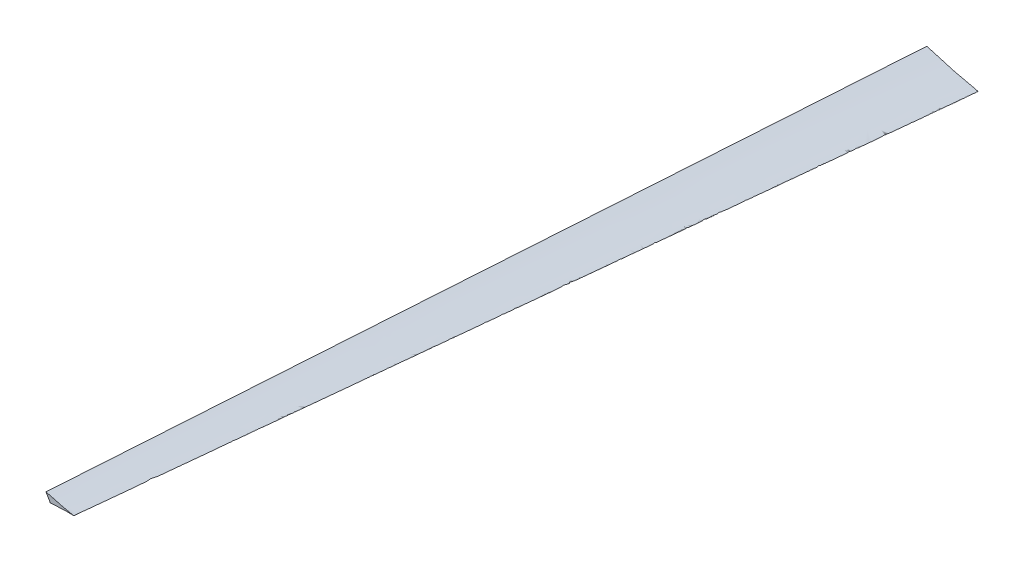
ISO-10303-21;
HEADER;
FILE_DESCRIPTION(('STEP AP214'),'2;1');
FILE_NAME('part.step','',(''),(''),'','','');
FILE_SCHEMA(('AUTOMOTIVE_DESIGN { 1 0 10303 214 1 1 1 1 }'));
ENDSEC;
DATA;
#1=APPLICATION_CONTEXT('core data for automotive mechanical design processes');
#2=APPLICATION_PROTOCOL_DEFINITION('international standard','automotive_design',2000,#1);
#3=PRODUCT_CONTEXT('',#1,'mechanical');
#4=PRODUCT('Part','Part','',(#3));
#5=PRODUCT_RELATED_PRODUCT_CATEGORY('part','',(#4));
#6=PRODUCT_DEFINITION_FORMATION('','',#4);
#7=PRODUCT_DEFINITION_CONTEXT('part definition',#1,'design');
#8=PRODUCT_DEFINITION('design','',#6,#7);
#9=PRODUCT_DEFINITION_SHAPE('','',#8);
#10=(LENGTH_UNIT() NAMED_UNIT(*) SI_UNIT(.MILLI.,.METRE.));
#11=(NAMED_UNIT(*) PLANE_ANGLE_UNIT() SI_UNIT($,.RADIAN.));
#12=(NAMED_UNIT(*) SI_UNIT($,.STERADIAN.) SOLID_ANGLE_UNIT());
#13=UNCERTAINTY_MEASURE_WITH_UNIT(LENGTH_MEASURE(1.E-05),#10,'distance_accuracy_value','');
#14=(GEOMETRIC_REPRESENTATION_CONTEXT(3) GLOBAL_UNCERTAINTY_ASSIGNED_CONTEXT((#13)) GLOBAL_UNIT_ASSIGNED_CONTEXT((#10,
#11,#12)) REPRESENTATION_CONTEXT('',''));
#15=CARTESIAN_POINT('',(0.,0.,0.));
#16=DIRECTION('',(0.,0.,1.));
#17=DIRECTION('',(1.,0.,0.));
#18=AXIS2_PLACEMENT_3D('',#15,#16,#17);
#19=CARTESIAN_POINT('',(-17.154805273375,-0.0944313994261866,225.));
#20=DIRECTION('',(0.,0.,1.));
#21=DIRECTION('',(1.,0.,0.));
#22=AXIS2_PLACEMENT_3D('',#19,#20,#21);
#23=PLANE('',#22);
#24=CARTESIAN_POINT('',(-17.154805273375,4.28745633119217,225.));
#25=CARTESIAN_POINT('',(-16.8274548071553,4.1785414780869,225.));
#26=CARTESIAN_POINT('',(-16.4997626321677,4.07062789318902,225.));
#27=CARTESIAN_POINT('',(-15.8434358874469,3.85764369440727,225.));
#28=CARTESIAN_POINT('',(-15.5148012638477,3.75257324675611,225.));
#29=CARTESIAN_POINT('',(-14.8564420552127,3.54615163630799,225.));
#30=CARTESIAN_POINT('',(-14.5267177290347,3.44479965095829,225.));
#31=CARTESIAN_POINT('',(-13.8659769446236,3.24642624477634,225.));
#32=CARTESIAN_POINT('',(-13.5349605213973,3.14940470749253,225.));
#33=CARTESIAN_POINT('',(-12.8716483663999,2.95979194422028,225.));
#34=CARTESIAN_POINT('',(-12.5393525844816,2.86720089384415,225.));
#35=CARTESIAN_POINT('',(-11.8737026407707,2.68589221610166,225.));
#36=CARTESIAN_POINT('',(-11.5403484606969,2.59717465603556,225.));
#37=CARTESIAN_POINT('',(-10.8733992873959,2.42315086030483,225.));
#38=CARTESIAN_POINT('',(-10.5398058295831,2.3378387249274,225.));
#39=CARTESIAN_POINT('',(-9.87195586824423,2.16984964748878,225.));
#40=CARTESIAN_POINT('',(-9.53769936173265,2.08717271732175,225.));
#41=CARTESIAN_POINT('',(-8.86860293943237,1.92411829040412,225.));
#42=CARTESIAN_POINT('',(-8.5337629863441,1.84374094685014,225.));
#43=CARTESIAN_POINT('',(-8.03115106262943,1.72466007935411,225.));
#44=CARTESIAN_POINT('',(-7.86355452081473,1.68521385040906,225.));
#45=CARTESIAN_POINT('',(-7.52825652693458,1.60676901085397,225.));
#46=CARTESIAN_POINT('',(-7.36055507475669,1.5677704007245,225.));
#47=CARTESIAN_POINT('',(-6.85730799932812,1.45156090581878,225.));
#48=CARTESIAN_POINT('',(-6.52158219389296,1.37512746124543,225.));
#49=CARTESIAN_POINT('',(-5.84951843928526,1.22501059156834,225.));
#50=CARTESIAN_POINT('',(-5.51318049849608,1.15132712909572,225.));
#51=CARTESIAN_POINT('',(-5.09242218145986,1.06133418195883,225.));
#52=CARTESIAN_POINT('',(-5.00833595324813,1.04345846511535,225.));
#53=CARTESIAN_POINT('',(-4.84011044559487,1.00795412760479,225.));
#54=CARTESIAN_POINT('',(-4.75597116558311,0.990325509642685,225.));
#55=CARTESIAN_POINT('',(-4.58772223709505,0.954907069724684,225.));
#56=CARTESIAN_POINT('',(-4.50361259024164,0.937117240043234,225.));
#57=CARTESIAN_POINT('',(-4.33550758699842,0.900956519205938,225.));
#58=CARTESIAN_POINT('',(-4.25151224353212,0.882585567253631,225.));
#59=CARTESIAN_POINT('',(-4.12569105641751,0.854266008962863,225.));
#60=CARTESIAN_POINT('',(-4.08377945012938,0.844699003817836,225.));
#61=CARTESIAN_POINT('',(-4.00002919467849,0.825257465364728,225.));
#62=CARTESIAN_POINT('',(-3.95819054264279,0.815382944469214,225.));
#63=CARTESIAN_POINT('',(-3.89549767905875,0.800299184135946,225.));
#64=CARTESIAN_POINT('',(-3.87461072982699,0.795225889118305,225.));
#65=CARTESIAN_POINT('',(-3.83286163533248,0.784983248998435,225.));
#66=CARTESIAN_POINT('',(-3.81199948878042,0.779813909144001,225.));
#67=CARTESIAN_POINT('',(-3.77029924049977,0.769367507842391,225.));
#68=CARTESIAN_POINT('',(-3.74946114201541,0.764090433329219,225.));
#69=CARTESIAN_POINT('',(-3.71822232217621,0.756100728274336,225.));
#70=CARTESIAN_POINT('',(-3.70781182720182,0.753424985364002,225.));
#71=CARTESIAN_POINT('',(-3.69220326178913,0.749377434636501,225.));
#72=CARTESIAN_POINT('',(-3.68700127796039,0.748022509265604,225.));
#73=CARTESIAN_POINT('',(-3.67659361044561,0.745328448450249,225.));
#74=CARTESIAN_POINT('',(-3.67138792616977,0.743989316893821,225.));
#75=CARTESIAN_POINT('',(-3.66521703496061,0.742341741978213,225.));
#76=CARTESIAN_POINT('',(-3.66424292685249,0.742079879254696,225.));
#77=CARTESIAN_POINT('',(-3.66227502606838,0.741642940281884,225.));
#78=CARTESIAN_POINT('',(-3.66128123515484,0.741467856298407,225.));
#79=CARTESIAN_POINT('',(-3.65832373585265,0.740837406072157,225.));
#80=CARTESIAN_POINT('',(-3.6563841408231,0.74027685803549,225.));
#81=CARTESIAN_POINT('',(-3.65249412694959,0.739198343487737,225.));
#82=CARTESIAN_POINT('',(-3.65054369877125,0.738680423007299,225.));
#83=CARTESIAN_POINT('',(-3.64664508413204,0.737634000052776,225.));
#84=CARTESIAN_POINT('',(-3.6446968975096,0.737105498399429,225.));
#85=CARTESIAN_POINT('',(-3.64080046512747,0.736052349809715,225.));
#86=CARTESIAN_POINT('',(-3.63885221966218,0.735527701506108,225.));
#87=CARTESIAN_POINT('',(-3.62912577391706,0.732909551205257,225.));
#88=CARTESIAN_POINT('',(-3.62134658390424,0.73081910600019,225.));
#89=CARTESIAN_POINT('',(-3.60578374931739,0.726651030484382,225.));
#90=CARTESIAN_POINT('',(-3.59800010428712,0.724573401922848,225.));
#91=CARTESIAN_POINT('',(-3.5746326556693,0.718354596854568,225.));
#92=CARTESIAN_POINT('',(-3.55904422767682,0.714230702693071,225.));
#93=CARTESIAN_POINT('',(-3.51212162435943,0.701893434567751,225.));
#94=CARTESIAN_POINT('',(-3.48076857928444,0.69375177768733,225.));
#95=CARTESIAN_POINT('',(-3.41801270675731,0.677658599796939,225.));
#96=CARTESIAN_POINT('',(-3.38660987780582,0.669707084634112,225.));
#97=CARTESIAN_POINT('',(-3.32405533048183,0.654070246776757,225.));
#98=CARTESIAN_POINT('',(-3.29290406502051,0.646383111429674,225.));
#99=CARTESIAN_POINT('',(-3.23055752445818,0.631198114504695,225.));
#100=CARTESIAN_POINT('',(-3.19936225239717,0.623700240469484,225.));
#101=CARTESIAN_POINT('',(-3.16042484995846,0.614466820167934,225.));
#102=CARTESIAN_POINT('',(-3.15270373313613,0.612642011848339,225.));
#103=CARTESIAN_POINT('',(-3.13725750879792,0.609003735334887,225.));
#104=CARTESIAN_POINT('',(-3.12953240085992,0.607190268863578,225.));
#105=CARTESIAN_POINT('',(-3.11383593754043,0.603518076207636,225.));
#106=CARTESIAN_POINT('',(-3.10586450712097,0.601659728491853,225.));
#107=CARTESIAN_POINT('',(-3.0899206522803,0.597955753518307,225.));
#108=CARTESIAN_POINT('',(-3.0819482297589,0.596110121136527,225.));
#109=CARTESIAN_POINT('',(-3.06571389109494,0.592690870335003,225.));
#110=CARTESIAN_POINT('',(-3.05745009387546,0.591126253510152,225.));
#111=CARTESIAN_POINT('',(-3.04162116039135,0.588077777033081,225.));
#112=CARTESIAN_POINT('',(-3.03405521991084,0.586598060980688,225.));
#113=CARTESIAN_POINT('',(-3.02303042831966,0.584184046578137,225.));
#114=CARTESIAN_POINT('',(-3.01954353537087,0.583382441190433,225.));
#115=CARTESIAN_POINT('',(-3.01387282301738,0.581906147209993,225.));
#116=CARTESIAN_POINT('',(-3.01167476480427,0.581290759728336,225.));
#117=CARTESIAN_POINT('',(-3.00739326457138,0.579891400688233,225.));
#118=CARTESIAN_POINT('',(-3.00530833122601,0.579112016304118,225.));
#119=CARTESIAN_POINT('',(-3.00264169503904,0.578135834360096,225.));
#120=CARTESIAN_POINT('',(-3.00206258646044,0.577925080208735,225.));
#121=CARTESIAN_POINT('',(-3.00085965518218,0.577495254586606,225.));
#122=CARTESIAN_POINT('',(-3.00023552631687,0.57727662553344,225.));
#123=CARTESIAN_POINT('',(-2.99924573830725,0.576903545803914,225.));
#124=CARTESIAN_POINT('',(-2.99887438763264,0.576757403600882,225.));
#125=CARTESIAN_POINT('',(-2.99815948532871,0.576535510814437,225.));
#126=CARTESIAN_POINT('',(-2.99782088588455,0.576452266799612,225.));
#127=CARTESIAN_POINT('',(-2.99743622946987,0.576084050380615,225.));
#128=CARTESIAN_POINT('',(-2.99732797917685,0.575916829913171,225.));
#129=CARTESIAN_POINT('',(-2.99731846443562,0.575582325756103,225.));
#130=CARTESIAN_POINT('',(-2.99741449170376,0.575415071926438,225.));
#131=CARTESIAN_POINT('',(-2.99763058990211,0.57514390033606,225.));
#132=CARTESIAN_POINT('',(-2.9977491129938,0.575037090540749,225.));
#133=CARTESIAN_POINT('',(-2.99801249519448,0.574830932659052,225.));
#134=CARTESIAN_POINT('',(-2.99815867932423,0.574732792017633,225.));
#135=CARTESIAN_POINT('',(-2.99875677864825,0.574368407379817,225.));
#136=CARTESIAN_POINT('',(-2.99923755098296,0.574156803282837,225.));
#137=CARTESIAN_POINT('',(-3.00023699953781,0.573780242324813,225.));
#138=CARTESIAN_POINT('',(-3.00075642274887,0.573617480638455,225.));
#139=CARTESIAN_POINT('',(-3.00232321202461,0.573196546046507,225.));
#140=CARTESIAN_POINT('',(-3.00338804266163,0.573001672156346,225.));
#141=CARTESIAN_POINT('',(-3.00550123673462,0.572762959594685,225.));
#142=CARTESIAN_POINT('',(-3.00654917082746,0.572714869932024,225.));
#143=CARTESIAN_POINT('',(-3.00885539206171,0.572731437702185,225.));
#144=CARTESIAN_POINT('',(-3.0101130094573,0.572821079123196,225.));
#145=CARTESIAN_POINT('',(-3.01262981569765,0.572965280922988,225.));
#146=CARTESIAN_POINT('',(-3.01388900503319,0.573019819708073,225.));
#147=CARTESIAN_POINT('',(-3.01766602889692,0.573194045402037,225.));
#148=CARTESIAN_POINT('',(-3.0201835963714,0.573324351311769,225.));
#149=CARTESIAN_POINT('',(-3.02526701691628,0.573582594674771,225.));
#150=CARTESIAN_POINT('',(-3.02783287105203,0.573710438931706,225.));
#151=CARTESIAN_POINT('',(-3.03296420056645,0.573970041567609,225.));
#152=CARTESIAN_POINT('',(-3.03552967595844,0.574101799594211,225.));
#153=CARTESIAN_POINT('',(-3.04829608693929,0.57476186140483,225.));
#154=CARTESIAN_POINT('',(-3.05849630676072,0.575303232542896,225.));
#155=CARTESIAN_POINT('',(-3.07889586309809,0.576411651998802,225.));
#156=CARTESIAN_POINT('',(-3.08909519954762,0.57697870155472,225.));
#157=CARTESIAN_POINT('',(-3.10940965602912,0.578126025189434,225.));
#158=CARTESIAN_POINT('',(-3.11952478436374,0.578706153660477,225.));
#159=CARTESIAN_POINT('',(-3.13975414039082,0.57987867864631,225.));
#160=CARTESIAN_POINT('',(-3.14986836809638,0.580471074936353,225.));
#161=CARTESIAN_POINT('',(-3.20053747623567,0.583447979451554,225.));
#162=CARTESIAN_POINT('',(-3.24109081066037,0.585860041341564,225.));
#163=CARTESIAN_POINT('',(-3.32221098128255,0.59044817108018,225.));
#164=CARTESIAN_POINT('',(-3.36277781750137,0.592624238554107,225.));
#165=CARTESIAN_POINT('',(-3.4440554688945,0.596843599158316,225.));
#166=CARTESIAN_POINT('',(-3.48476630808849,0.598886419584199,225.));
#167=CARTESIAN_POINT('',(-3.56619317899834,0.602871699749472,225.));
#168=CARTESIAN_POINT('',(-3.6069092107506,0.604814158741499,225.));
#169=CARTESIAN_POINT('',(-3.81033979871796,0.614457325326993,225.));
#170=CARTESIAN_POINT('',(-3.9730631624705,0.621972707122369,225.));
#171=CARTESIAN_POINT('',(-4.29854396124656,0.636203601520358,225.));
#172=CARTESIAN_POINT('',(-4.46130139580784,0.642919124348926,225.));
#173=CARTESIAN_POINT('',(-4.7053692792409,0.651974525275915,225.));
#174=CARTESIAN_POINT('',(-4.78666079443199,0.654821817029735,225.));
#175=CARTESIAN_POINT('',(-4.94925645873141,0.660108593381518,225.));
#176=CARTESIAN_POINT('',(-5.03056060771242,0.662548081852617,225.));
#177=CARTESIAN_POINT('',(-5.19318262289072,0.666952368291811,225.));
#178=CARTESIAN_POINT('',(-5.27450048922,0.668917161397424,225.));
#179=CARTESIAN_POINT('',(-5.43714754430569,0.672404521754121,225.));
#180=CARTESIAN_POINT('',(-5.51847673328358,0.673927078593644,225.));
#181=CARTESIAN_POINT('',(-5.68130552534967,0.676557400618646,225.));
#182=CARTESIAN_POINT('',(-5.76280514193776,0.677664324701541,225.));
#183=CARTESIAN_POINT('',(-5.92581166102893,0.679486135845279,225.));
#184=CARTESIAN_POINT('',(-6.00731856368842,0.680201008858527,225.));
#185=CARTESIAN_POINT('',(-6.12957934694492,0.68099907207233,225.));
#186=CARTESIAN_POINT('',(-6.17033238870746,0.681219384151621,225.));
#187=CARTESIAN_POINT('',(-6.25183931478383,0.681571957808514,225.));
#188=CARTESIAN_POINT('',(-6.29259319910199,0.681704218411579,225.));
#189=CARTESIAN_POINT('',(-6.35372274968645,0.681838983342992,225.));
#190=CARTESIAN_POINT('',(-6.37409835302857,0.681873300571639,225.));
#191=CARTESIAN_POINT('',(-6.4148493796591,0.68192126415413,225.));
#192=CARTESIAN_POINT('',(-6.43522480294723,0.681934910718371,225.));
#193=CARTESIAN_POINT('',(-6.47597489876445,0.681941462865774,225.));
#194=CARTESIAN_POINT('',(-6.49634957129372,0.681934369208683,225.));
#195=CARTESIAN_POINT('',(-6.53709959862784,0.681901678035809,225.));
#196=CARTESIAN_POINT('',(-6.55747495343306,0.68187607991032,225.));
#197=CARTESIAN_POINT('',(-6.58803995743583,0.681819010126741,225.));
#198=CARTESIAN_POINT('',(-6.59822965811541,0.681796871561895,225.));
#199=CARTESIAN_POINT('',(-6.61351397883151,0.681765537737341,225.));
#200=CARTESIAN_POINT('',(-6.61860855126687,0.681755405760031,225.));
#201=CARTESIAN_POINT('',(-6.62879723679257,0.68172361821442,225.));
#202=CARTESIAN_POINT('',(-6.63389134989306,0.681701963238979,225.));
#203=CARTESIAN_POINT('',(-6.64153334711404,0.681698177176817,225.));
#204=CARTESIAN_POINT('',(-6.64408095405511,0.68170169884781,225.));
#205=CARTESIAN_POINT('',(-6.64917501982737,0.681629655282381,225.));
#206=CARTESIAN_POINT('',(-6.65172147867644,0.681554091324184,225.));
#207=CARTESIAN_POINT('',(-6.65936058527897,0.68132522948828,225.));
#208=CARTESIAN_POINT('',(-6.66445289206046,0.681169763696192,225.));
#209=CARTESIAN_POINT('',(-6.67973075646229,0.680722286952276,225.));
#210=CARTESIAN_POINT('',(-6.68991706600691,0.680449203213598,225.));
#211=CARTESIAN_POINT('',(-6.72047549101707,0.679681496268192,225.));
#212=CARTESIAN_POINT('',(-6.74084875755153,0.679238364599858,225.));
#213=CARTESIAN_POINT('',(-6.78159734788117,0.678477675702374,225.));
#214=CARTESIAN_POINT('',(-6.80197267163627,0.678160116374571,225.));
#215=CARTESIAN_POINT('',(-6.86310018956626,0.677359112111544,225.));
#216=CARTESIAN_POINT('',(-6.90385429816796,0.677027332426644,225.));
#217=CARTESIAN_POINT('',(-6.98536467522526,0.676602231085802,225.));
#218=CARTESIAN_POINT('',(-7.02612094370806,0.676508917155513,225.));
#219=CARTESIAN_POINT('',(-7.10763295328583,0.676390021396336,225.));
#220=CARTESIAN_POINT('',(-7.14838869438134,0.676364438764475,225.));
#221=CARTESIAN_POINT('',(-7.22989972312666,0.67623586187134,225.));
#222=CARTESIAN_POINT('',(-7.27065501077223,0.676132868939333,225.));
#223=CARTESIAN_POINT('',(-7.39291718055841,0.675358122303915,225.));
#224=CARTESIAN_POINT('',(-7.47442070277906,0.674220603727059,225.));
#225=CARTESIAN_POINT('',(-7.6374314691538,0.671745599563877,225.));
#226=CARTESIAN_POINT('',(-7.71893871279898,0.670408092976662,225.));
#227=CARTESIAN_POINT('',(-7.88194983043221,0.667420244734924,225.));
#228=CARTESIAN_POINT('',(-7.96345370430551,0.665769896145862,225.));
#229=CARTESIAN_POINT('',(-8.12645439703051,0.662191577427787,225.));
#230=CARTESIAN_POINT('',(-8.20795121594233,0.660263609959833,225.));
#231=CARTESIAN_POINT('',(-8.37093690537427,0.656125571697904,225.));
#232=CARTESIAN_POINT('',(-8.45242577596717,0.653915503790126,225.));
#233=CARTESIAN_POINT('',(-8.61539355297758,0.649219457399596,225.));
#234=CARTESIAN_POINT('',(-8.69687245959002,0.646733485665632,225.));
#235=CARTESIAN_POINT('',(-8.85982178647566,0.641488895423208,225.));
#236=CARTESIAN_POINT('',(-8.94129220671739,0.638730275937613,225.));
#237=CARTESIAN_POINT('',(-9.18568903892092,0.630051567349473,225.));
#238=CARTESIAN_POINT('',(-9.34860115766905,0.623728624203748,225.));
#239=CARTESIAN_POINT('',(-9.83753994467401,0.603184144744041,225.));
#240=CARTESIAN_POINT('',(-10.1635022486921,0.587394746748477,225.));
#241=CARTESIAN_POINT('',(-10.6522832519098,0.560766987633619,225.));
#242=CARTESIAN_POINT('',(-10.8151842534121,0.551400385955469,225.));
#243=CARTESIAN_POINT('',(-11.1409289719396,0.531718030775066,225.));
#244=CARTESIAN_POINT('',(-11.3037726890414,0.521402278544923,225.));
#245=CARTESIAN_POINT('',(-11.6293890252272,0.499852892368571,225.));
#246=CARTESIAN_POINT('',(-11.7921616481329,0.488619316087452,225.));
#247=CARTESIAN_POINT('',(-12.0362730891069,0.471107463044834,225.));
#248=CARTESIAN_POINT('',(-12.1176357516123,0.465159923049198,225.));
#249=CARTESIAN_POINT('',(-12.2803445332283,0.453042428855844,225.));
#250=CARTESIAN_POINT('',(-12.3616906523288,0.446872474524232,225.));
#251=CARTESIAN_POINT('',(-12.6057119040873,0.428149588117254,225.));
#252=CARTESIAN_POINT('',(-12.7683707049235,0.41538357598249,225.));
#253=CARTESIAN_POINT('',(-13.0936412378088,0.389267868485991,225.));
#254=CARTESIAN_POINT('',(-13.2562529699172,0.375918173864164,225.));
#255=CARTESIAN_POINT('',(-13.5628986132119,0.350202828459392,225.));
#256=CARTESIAN_POINT('',(-13.7069376657176,0.33789842563595,225.));
#257=CARTESIAN_POINT('',(-13.9949759569606,0.312846328982323,225.));
#258=CARTESIAN_POINT('',(-14.1389751960335,0.300098639011406,225.));
#259=CARTESIAN_POINT('',(-14.4268519553408,0.27417306490237,225.));
#260=CARTESIAN_POINT('',(-14.5707294981013,0.260995430828219,225.));
#261=CARTESIAN_POINT('',(-14.8584454974939,0.234208390950708,225.));
#262=CARTESIAN_POINT('',(-15.0022839538185,0.220598981844737,225.));
#263=CARTESIAN_POINT('',(-15.1461019106277,0.206776453082405,225.));
#264=B_SPLINE_CURVE_WITH_KNOTS('',3,(#24,#25,#26,#27,#28,#29,#30,#31,#32,#33,#34,#35,#36,#37,
#38,#39,#40,#41,#42,#43,#44,#45,#46,#47,#48,#49,#50,#51,#52,#53,#54,#55,#56,#57,#58,#59,#60,#61,
#62,#63,#64,#65,#66,#67,#68,#69,#70,#71,#72,#73,#74,#75,#76,#77,#78,#79,#80,#81,#82,#83,#84,#85,
#86,#87,#88,#89,#90,#91,#92,#93,#94,#95,#96,#97,#98,#99,#100,#101,#102,#103,#104,#105,#106,#107,
#108,#109,#110,#111,#112,#113,#114,#115,#116,#117,#118,#119,#120,#121,#122,#123,#124,#125,#126,
#127,#128,#129,#130,#131,#132,#133,#134,#135,#136,#137,#138,#139,#140,#141,#142,#143,#144,#145,
#146,#147,#148,#149,#150,#151,#152,#153,#154,#155,#156,#157,#158,#159,#160,#161,#162,#163,#164,
#165,#166,#167,#168,#169,#170,#171,#172,#173,#174,#175,#176,#177,#178,#179,#180,#181,#182,#183,
#184,#185,#186,#187,#188,#189,#190,#191,#192,#193,#194,#195,#196,#197,#198,#199,#200,#201,#202,
#203,#204,#205,#206,#207,#208,#209,#210,#211,#212,#213,#214,#215,#216,#217,#218,#219,#220,#221,
#222,#223,#224,#225,#226,#227,#228,#229,#230,#231,#232,#233,#234,#235,#236,#237,#238,#239,#240,
#241,#242,#243,#244,#245,#246,#247,#248,#249,#250,#251,#252,#253,#254,#255,#256,#257,#258,#259,
#260,#261,#262,#263),.UNSPECIFIED.,.F.,.F.,(4,2,2,2,2,2,2,2,2,2,2,2,2,2,2,2,2,2,2,2,2,2,2,2,2,2,
2,2,2,2,2,2,2,2,2,2,2,2,2,2,2,2,2,2,2,2,2,2,2,2,2,2,2,2,2,2,2,2,2,2,2,2,2,2,2,2,2,2,2,2,2,2,2,2,
2,2,2,2,2,2,2,2,2,2,2,2,2,2,2,2,2,2,2,2,2,2,2,2,2,2,2,2,2,2,2,2,2,2,2,2,2,2,2,2,2,2,2,2,2,4),
(0.,1.03499246503269,2.07004531388018,3.10486780329656,4.13966244816034,5.17449807551398,
6.20935167555225,7.2423268774194,8.27530674102344,9.30835526143541,9.82488302051278,
10.3414113341068,11.3743524484741,12.4072795213254,12.665175168689,12.9230736370184,
13.1809845303664,13.4389224959325,13.5678905450298,13.6968533951898,13.7613359361873,
13.825814964224,13.8903018592491,13.9225490873381,13.9386747170035,13.9548042368302,
13.9578288213369,13.960853136228,13.9669024788473,13.9729582703092,13.9790135938529,
13.985066653582,14.0092319395123,14.0334004536065,14.0817744198835,14.1789525049277,
14.2761335745108,14.3723902001445,14.4686404734899,14.4924420012689,14.5162470601664,
14.5408036102627,14.565349605836,14.5905788466542,14.6137045342053,14.6244366231596,
14.6312789798613,14.6379506911321,14.6398006326225,14.6417793631444,14.6429848180262,
14.6439988177876,14.6445198341654,14.6450339860624,14.6455208310792,14.6460451553859,
14.6476141064384,14.6492455863727,14.6524794548056,14.6556187340272,14.6593980059667,
14.6631796005423,14.6707419577163,14.6784491898066,14.6861557300869,14.7167994753268,
14.7474446996226,14.7778399429939,14.808234630017,14.930109334319,15.0519842321137,
15.1742702958769,15.2965572701379,15.7852471160521,16.273930713544,16.5179539847954,
16.7619749382903,17.0059983912772,17.2500275888392,17.4945479924358,17.739077156878,
17.8613379939187,17.983600184098,18.0447270739717,18.1058533416596,18.1669773702234,
18.2281034128633,18.258672658521,18.2739563048467,18.2892391649021,18.2968814144136,
18.3045235404089,18.3198080055295,18.3503775125398,18.411511560203,18.4726445861077,
18.5949095343997,18.7171784436988,18.8394459034604,18.9617112637298,19.2062409846633,
19.4507964019,19.6953572406508,19.9399157353701,20.1844717281881,20.4290217403247,
20.6735726289294,21.1626740000542,22.1416774092576,22.631185583151,23.1206931009847,
23.6101698876336,23.8549088691637,24.0996479980306,24.5891239284021,25.0785992383053,
25.5122894977948,25.9459759825117,26.3794145720609,26.8128564777434),.UNSPECIFIED.);
#265=CARTESIAN_POINT('',(-17.154805273375,4.28745633119217,225.));
#266=VERTEX_POINT('',#265);
#267=CARTESIAN_POINT('',(-14.8168748482416,0.238042050299872,225.));
#268=VERTEX_POINT('',#267);
#269=EDGE_CURVE('E78',#266,#268,#264,.T.);
#270=ORIENTED_EDGE('',*,*,#269,.T.);
#271=DIRECTION('',(-0.499999999999995,0.866025403784442,0.));
#272=VECTOR('',#271,1.);
#273=CARTESIAN_POINT('',(-11.0095809048169,-6.35638449906094,225.));
#274=LINE('',#273,#272);
#275=EDGE_CURVE('E76',#268,#266,#274,.T.);
#276=ORIENTED_EDGE('',*,*,#275,.T.);
#277=EDGE_LOOP('',(#270,#276));
#278=FACE_BOUND('',#277,.T.);
#279=ADVANCED_FACE('F45',(#278),#23,.F.);
#280=CARTESIAN_POINT('',(-26.8179624698927,0.255730310269387,450.));
#281=DIRECTION('',(0.,0.,1.));
#282=DIRECTION('',(1.,0.,0.));
#283=AXIS2_PLACEMENT_3D('',#280,#281,#282);
#284=PLANE('',#283);
#285=CARTESIAN_POINT('',(-34.3096105467501,2.11915561436099,450.));
#286=CARTESIAN_POINT('',(-34.1843140186687,2.08037090106155,450.));
#287=CARTESIAN_POINT('',(-34.0589937911828,2.04165872268453,450.));
#288=CARTESIAN_POINT('',(-33.808205326479,1.96469366889345,450.));
#289=CARTESIAN_POINT('',(-33.6827370817753,1.92644081790798,450.));
#290=CARTESIAN_POINT('',(-33.4316151539328,1.85072788111107,450.));
#291=CARTESIAN_POINT('',(-33.3059615643597,1.81326748614175,450.));
#292=CARTESIAN_POINT('',(-33.0543284112542,1.73946545959841,450.));
#293=CARTESIAN_POINT('',(-32.9283488555736,1.70312380134355,450.));
#294=CARTESIAN_POINT('',(-32.6760234432967,1.63180924460107,450.));
#295=CARTESIAN_POINT('',(-32.5496776450091,1.59683613984041,450.));
#296=CARTESIAN_POINT('',(-32.2966668870952,1.52806037139076,450.));
#297=CARTESIAN_POINT('',(-32.1700019230362,1.49425772405497,450.));
#298=CARTESIAN_POINT('',(-31.7900188674627,1.39450394383031,450.));
#299=CARTESIAN_POINT('',(-31.5362969457865,1.33009060979413,450.));
#300=CARTESIAN_POINT('',(-31.0281218303097,1.20412365474526,450.));
#301=CARTESIAN_POINT('',(-30.773668558743,1.14257035076694,450.));
#302=CARTESIAN_POINT('',(-30.2643416266986,1.02117115747035,450.));
#303=CARTESIAN_POINT('',(-30.0094679459733,0.961325353088517,450.));
#304=CARTESIAN_POINT('',(-29.6267978051559,0.873175145593007,450.));
#305=CARTESIAN_POINT('',(-29.4991874569211,0.844062888716418,450.));
#306=CARTESIAN_POINT('',(-29.2438416621925,0.786422538448037,450.));
#307=CARTESIAN_POINT('',(-29.1161062224295,0.757894415259886,450.));
#308=CARTESIAN_POINT('',(-28.8605016190396,0.701472189368807,450.));
#309=CARTESIAN_POINT('',(-28.7326324619692,0.673578056976008,450.));
#310=CARTESIAN_POINT('',(-28.4767320002426,0.618467917403486,450.));
#311=CARTESIAN_POINT('',(-28.3487006780971,0.591251991339287,450.));
#312=CARTESIAN_POINT('',(-28.1565387360925,0.550975790844814,450.));
#313=CARTESIAN_POINT('',(-28.0924654392703,0.537641640271474,450.));
#314=CARTESIAN_POINT('',(-27.9963257217265,0.517782318018164,450.));
#315=CARTESIAN_POINT('',(-27.9642739613701,0.511186148589015,450.));
#316=CARTESIAN_POINT('',(-27.9001608414541,0.498041060289926,450.));
#317=CARTESIAN_POINT('',(-27.8680994819213,0.491492141289536,450.));
#318=CARTESIAN_POINT('',(-27.8039667146125,0.478445951525569,450.));
#319=CARTESIAN_POINT('',(-27.771895306979,0.471948680061301,450.));
#320=CARTESIAN_POINT('',(-27.7237822324901,0.462231979594748,450.));
#321=CARTESIAN_POINT('',(-27.707743516904,0.458997941156607,450.));
#322=CARTESIAN_POINT('',(-27.675660677972,0.452556746317319,450.));
#323=CARTESIAN_POINT('',(-27.659616554624,0.449349589926852,450.));
#324=CARTESIAN_POINT('',(-27.6115039203124,0.439635488910673,450.));
#325=CARTESIAN_POINT('',(-27.5794540596072,0.433035701984637,450.));
#326=CARTESIAN_POINT('',(-27.515406887106,0.41958753257591,450.));
#327=CARTESIAN_POINT('',(-27.4834095749113,0.412739151988723,450.));
#328=CARTESIAN_POINT('',(-27.427457275498,0.400564939564586,450.));
#329=CARTESIAN_POINT('',(-27.4034919355534,0.395286589093609,450.));
#330=CARTESIAN_POINT('',(-27.3555864112793,0.384616969561546,450.));
#331=CARTESIAN_POINT('',(-27.3316462269619,0.379225700445713,450.));
#332=CARTESIAN_POINT('',(-27.2598617700515,0.362898661322243,450.));
#333=CARTESIAN_POINT('',(-27.2120523609167,0.351809390259607,450.));
#334=CARTESIAN_POINT('',(-27.1403973209392,0.33493018133932,450.));
#335=CARTESIAN_POINT('',(-27.1165226072741,0.329263004889721,450.));
#336=CARTESIAN_POINT('',(-27.0807233740725,0.320708536134693,450.));
#337=CARTESIAN_POINT('',(-27.068792442329,0.317848097429162,450.));
#338=CARTESIAN_POINT('',(-27.0508990476156,0.313544970352693,450.));
#339=CARTESIAN_POINT('',(-27.0449350838179,0.312108516641625,450.));
#340=CARTESIAN_POINT('',(-27.0151176557707,0.304916247622564,450.));
#341=CARTESIAN_POINT('',(-26.9912714177986,0.299130443766384,450.));
#342=CARTESIAN_POINT('',(-26.9435864725473,0.287503748767734,450.));
#343=CARTESIAN_POINT('',(-26.9197477683437,0.281662845029795,450.));
#344=CARTESIAN_POINT('',(-26.8720922050329,0.269940012014519,450.));
#345=CARTESIAN_POINT('',(-26.8482753409224,0.264058103105495,450.));
#346=CARTESIAN_POINT('',(-26.8125627930085,0.255212195409712,450.));
#347=CARTESIAN_POINT('',(-26.8006640216003,0.252260537674079,450.));
#348=CARTESIAN_POINT('',(-26.7828077675077,0.247824846759548,450.));
#349=CARTESIAN_POINT('',(-26.7768495968751,0.246343735862265,450.));
#350=CARTESIAN_POINT('',(-26.764933853647,0.243380987414454,450.));
#351=CARTESIAN_POINT('',(-26.7589762810366,0.241899349894777,450.));
#352=CARTESIAN_POINT('',(-26.7500359358955,0.239671751763753,450.));
#353=CARTESIAN_POINT('',(-26.7470528708626,0.238927790464599,450.));
#354=CARTESIAN_POINT('',(-26.7410858000032,0.237444730987842,450.));
#355=CARTESIAN_POINT('',(-26.7381017941025,0.236705633567252,450.));
#356=CARTESIAN_POINT('',(-26.7321455519041,0.235209180793459,450.));
#357=CARTESIAN_POINT('',(-26.7291733083902,0.234451891087796,450.));
#358=CARTESIAN_POINT('',(-26.7231716321252,0.233219678866605,450.));
#359=CARTESIAN_POINT('',(-26.7201422220484,0.232744646730066,450.));
#360=CARTESIAN_POINT('',(-26.7140868254969,0.231832105213719,450.));
#361=CARTESIAN_POINT('',(-26.711060842637,0.231394530014321,450.));
#362=CARTESIAN_POINT('',(-26.7049868146779,0.230533548419085,450.));
#363=CARTESIAN_POINT('',(-26.7019387452218,0.23011024152087,450.));
#364=CARTESIAN_POINT('',(-26.6973695827128,0.229410430899206,450.));
#365=CARTESIAN_POINT('',(-26.6958426279283,0.229165553035392,450.));
#366=CARTESIAN_POINT('',(-26.6928154572599,0.228643381940117,450.));
#367=CARTESIAN_POINT('',(-26.6913152049724,0.228366670985107,450.));
#368=CARTESIAN_POINT('',(-26.6895900588595,0.227907244936626,450.));
#369=CARTESIAN_POINT('',(-26.6893361421513,0.227835935083002,450.));
#370=CARTESIAN_POINT('',(-26.6888180877605,0.227675285700695,450.));
#371=CARTESIAN_POINT('',(-26.6885541248801,0.227585188871506,450.));
#372=CARTESIAN_POINT('',(-26.6881224762655,0.227398105489133,450.));
#373=CARTESIAN_POINT('',(-26.6879498969631,0.227311520856629,450.));
#374=CARTESIAN_POINT('',(-26.6877134432582,0.227148784636796,450.));
#375=CARTESIAN_POINT('',(-26.6876409517356,0.227091989014175,450.));
#376=CARTESIAN_POINT('',(-26.6875563957653,0.226941560926746,450.));
#377=CARTESIAN_POINT('',(-26.6875384512219,0.226852790887114,450.));
#378=CARTESIAN_POINT('',(-26.6875839049033,0.226638351846483,450.));
#379=CARTESIAN_POINT('',(-26.6877287567048,0.22654479216303,450.));
#380=CARTESIAN_POINT('',(-26.68807032361,0.226358327078996,450.));
#381=CARTESIAN_POINT('',(-26.6882608116241,0.226284913345728,450.));
#382=CARTESIAN_POINT('',(-26.6891669087969,0.22598489247991,450.));
#383=CARTESIAN_POINT('',(-26.6899499344123,0.225861258667116,450.));
#384=CARTESIAN_POINT('',(-26.6926955421851,0.225537306743556,450.));
#385=CARTESIAN_POINT('',(-26.6946303050512,0.225508965982958,450.));
#386=CARTESIAN_POINT('',(-26.6979697620444,0.225440840999813,450.));
#387=CARTESIAN_POINT('',(-26.699368772334,0.22540660094834,450.));
#388=CARTESIAN_POINT('',(-26.7069936351979,0.22524670675938,450.));
#389=CARTESIAN_POINT('',(-26.713209750686,0.225213535005571,450.));
#390=CARTESIAN_POINT('',(-26.7265683520238,0.225275257801947,450.));
#391=CARTESIAN_POINT('',(-26.7337116486026,0.225389853007561,450.));
#392=CARTESIAN_POINT('',(-26.7683373574639,0.226299792219332,449.999999999999));
#393=CARTESIAN_POINT('',(-26.7957803265796,0.228104449712495,450.));
#394=CARTESIAN_POINT('',(-26.8361659172994,0.230932457319168,450.));
#395=CARTESIAN_POINT('',(-26.8491211712953,0.231865780275375,450.));
#396=CARTESIAN_POINT('',(-26.8750310765083,0.233693369710677,450.));
#397=CARTESIAN_POINT('',(-26.8879857265235,0.234587648928119,450.));
#398=CARTESIAN_POINT('',(-26.9536159484602,0.239061992344061,450.000000000001));
#399=CARTESIAN_POINT('',(-27.006302535473,0.242470481854012,450.));
#400=CARTESIAN_POINT('',(-27.1117055924003,0.248919489118184,450.));
#401=CARTESIAN_POINT('',(-27.1644220653571,0.25195995787476,450.));
#402=CARTESIAN_POINT('',(-27.2711435793968,0.257783110704752,450.));
#403=CARTESIAN_POINT('',(-27.3251490524496,0.260557814855105,450.));
#404=CARTESIAN_POINT('',(-27.4331729703188,0.265792754017349,450.));
#405=CARTESIAN_POINT('',(-27.4871914145568,0.26825300111147,450.000000000001));
#406=CARTESIAN_POINT('',(-27.756093706455,0.279833860334026,450.000000000002));
#407=CARTESIAN_POINT('',(-27.9710662315022,0.286975009046492,450.000000000001));
#408=CARTESIAN_POINT('',(-28.4011081483113,0.297245859950084,449.999999999999));
#409=CARTESIAN_POINT('',(-28.6161775419322,0.300375481560644,450.));
#410=CARTESIAN_POINT('',(-29.0440170766814,0.302705064164371,450.));
#411=CARTESIAN_POINT('',(-29.2567869909494,0.301947056115811,449.999999999999));
#412=CARTESIAN_POINT('',(-29.6822694201508,0.296720252447469,450.));
#413=CARTESIAN_POINT('',(-29.8949819375628,0.292251657168193,450.000000000002));
#414=CARTESIAN_POINT('',(-30.2756103438235,0.281031989252767,450.000000000002));
#415=CARTESIAN_POINT('',(-30.4435466673729,0.274957883848079,450.));
#416=CARTESIAN_POINT('',(-30.7793325336567,0.260623187543764,449.999999999999));
#417=CARTESIAN_POINT('',(-30.9471820731564,0.252362520310744,450.));
#418=CARTESIAN_POINT('',(-31.1988733644102,0.238361512776847,450.));
#419=CARTESIAN_POINT('',(-31.2827607935406,0.233425890416435,450.));
#420=CARTESIAN_POINT('',(-31.4505043707312,0.223043373952178,450.));
#421=CARTESIAN_POINT('',(-31.5343605187739,0.217596479562056,450.));
#422=CARTESIAN_POINT('',(-31.6606251460032,0.208956001098161,450.));
#423=CARTESIAN_POINT('',(-31.7030485316324,0.205978242220003,450.));
#424=CARTESIAN_POINT('',(-31.7878938752023,0.200002345323951,450.));
#425=CARTESIAN_POINT('',(-31.8303158331415,0.19700420728546,450.));
#426=CARTESIAN_POINT('',(-31.9575810836558,0.1879997064605,450.));
#427=CARTESIAN_POINT('',(-32.0424236738129,0.181983262537022,450.));
#428=CARTESIAN_POINT('',(-32.2120974873863,0.169872390010797,450.));
#429=CARTESIAN_POINT('',(-32.2969287111831,0.163777966747097,450.));
#430=CARTESIAN_POINT('',(-32.4665828911724,0.151477384574293,450.));
#431=CARTESIAN_POINT('',(-32.5514058473818,0.145271225901638,450.));
#432=CARTESIAN_POINT('',(-32.7210215211357,0.132710381262593,450.));
#433=CARTESIAN_POINT('',(-32.8058142411817,0.126355729178161,450.));
#434=CARTESIAN_POINT('',(-32.9753859368301,0.113459684883092,450.));
#435=CARTESIAN_POINT('',(-33.060164912354,0.10691829164151,450.));
#436=CARTESIAN_POINT('',(-33.14493520824,0.10026513202948,450.));
#437=B_SPLINE_CURVE_WITH_KNOTS('',3,(#285,#286,#287,#288,#289,#290,#291,#292,#293,#294,#295,
#296,#297,#298,#299,#300,#301,#302,#303,#304,#305,#306,#307,#308,#309,#310,#311,#312,#313,#314,
#315,#316,#317,#318,#319,#320,#321,#322,#323,#324,#325,#326,#327,#328,#329,#330,#331,#332,#333,
#334,#335,#336,#337,#338,#339,#340,#341,#342,#343,#344,#345,#346,#347,#348,#349,#350,#351,#352,
#353,#354,#355,#356,#357,#358,#359,#360,#361,#362,#363,#364,#365,#366,#367,#368,#369,#370,#371,
#372,#373,#374,#375,#376,#377,#378,#379,#380,#381,#382,#383,#384,#385,#386,#387,#388,#389,#390,
#391,#392,#393,#394,#395,#396,#397,#398,#399,#400,#401,#402,#403,#404,#405,#406,#407,#408,#409,
#410,#411,#412,#413,#414,#415,#416,#417,#418,#419,#420,#421,#422,#423,#424,#425,#426,#427,#428,
#429,#430,#431,#432,#433,#434,#435,#436),.UNSPECIFIED.,.F.,.F.,(4,2,2,2,2,2,2,2,2,2,2,2,2,2,2,2,
2,2,2,2,2,2,2,2,2,2,2,2,2,2,2,2,2,2,2,2,2,2,2,2,2,2,2,2,2,2,2,2,2,2,2,2,2,2,2,2,2,2,2,2,2,2,2,2,
2,2,2,2,2,2,2,2,2,2,2,4),(0.,0.393487935977276,0.78699670710822,1.18034901828368,
1.57369194109273,1.96697534775557,2.36026424701088,3.14554727771373,3.93091715039004,
4.71632602198044,5.10899173092664,5.50163736004644,5.89426456347585,6.28693850308263,
6.48327643026616,6.58144677635619,6.67961685131095,6.77778559213249,6.82687014766239,
6.87595472269248,6.9741205557648,7.07228564048846,7.14590456292791,7.21952352106179,
7.36675765249776,7.44037191486644,7.47717900628776,7.49558254815151,7.56919677058115,
7.64282824945001,7.71642544453221,7.75320371998899,7.77162214450507,7.79003962589436,
7.79926250105401,7.80848677923295,7.81768167870669,7.82687300479842,7.83604783327897,
7.84527711082536,7.84991854739806,7.85448561239683,7.85527710673598,7.85611070446532,
7.85669114467291,7.85695995749563,7.85719853179699,7.85763850071142,7.85827775487889,
7.86059295560604,7.86644956850542,7.87064112284481,7.88930275960158,7.91072905895085,
7.9932040057529,8.03217271478746,8.07112861346469,8.22951840239282,8.3879292559213,
8.55015835070019,8.71238121035413,9.35760972852835,10.0028512073688,10.6411314856867,
11.2793773044778,11.7835022164181,12.2876447298006,12.5397410535485,12.7918375184533,
12.9194207226643,13.0470040558497,13.3021709601527,13.5573204863354,13.8124694726489,
14.0675607989925,14.3226535338935),.UNSPECIFIED.);
#438=CARTESIAN_POINT('',(-34.3096105467501,2.11915561436099,450.));
#439=VERTEX_POINT('',#438);
#440=CARTESIAN_POINT('',(-33.1440439661007,0.10033507707139,450.));
#441=VERTEX_POINT('',#440);
#442=EDGE_CURVE('E85',#439,#441,#437,.T.);
#443=ORIENTED_EDGE('',*,*,#442,.F.);
#444=DIRECTION('',(-0.499999999999995,0.866025403784441,0.));
#445=VECTOR('',#444,1.);
#446=CARTESIAN_POINT('',(-29.3413519070472,-6.48612077474758,450.));
#447=LINE('',#446,#445);
#448=EDGE_CURVE('E11',#441,#439,#447,.T.);
#449=ORIENTED_EDGE('',*,*,#448,.F.);
#450=EDGE_LOOP('',(#443,#449));
#451=FACE_BOUND('',#450,.T.);
#452=ADVANCED_FACE('F100',(#451),#284,.T.);
#453=CARTESIAN_POINT('',(0.,0.,0.));
#454=CARTESIAN_POINT('',(-34.3096105467501,0.,450.));
#455=CARTESIAN_POINT('',(2.35539681927631,0.270746704499762,0.));
#456=CARTESIAN_POINT('',(-33.4425384690632,0.0825516021248429,450.));
#457=CARTESIAN_POINT('',(4.71220957718891,0.51130590002586,0.));
#458=CARTESIAN_POINT('',(-32.5783514719179,0.144259224484087,449.999999999999));
#459=CARTESIAN_POINT('',(9.45907165768016,0.88016641357371,0.));
#460=CARTESIAN_POINT('',(-30.8336554247353,0.267288499677668,450.000000000002));
#461=CARTESIAN_POINT('',(11.8491959375354,1.00717041714158,0.));
#462=CARTESIAN_POINT('',(-29.9543041083434,0.300801429090974,450.000000000002));
#463=CARTESIAN_POINT('',(14.6156340813502,1.05410829696468,0.));
#464=CARTESIAN_POINT('',(-28.9393902060664,0.302228720574049,450.000000000001));
#465=CARTESIAN_POINT('',(14.9964664172829,1.04567548052727,0.));
#466=CARTESIAN_POINT('',(-28.8013737954337,0.301637710811088,450.000000000001));
#467=CARTESIAN_POINT('',(15.3674400910152,1.06311316920738,0.));
#468=CARTESIAN_POINT('',(-28.6633808068798,0.300235442473779,450.000000000001));
#469=CARTESIAN_POINT('',(16.1331562944656,1.06894481953375,0.));
#470=CARTESIAN_POINT('',(-28.3824575907585,0.297357656452759,450.000000000001));
#471=CARTESIAN_POINT('',(17.0889467251276,1.06479378408477,0.));
#472=CARTESIAN_POINT('',(-28.0319902374884,0.289597939077022,450.000000000001));
#473=CARTESIAN_POINT('',(18.5316690137933,1.02071892186908,0.));
#474=CARTESIAN_POINT('',(-27.5029329264989,0.26966078287003,450.000000000001));
#475=CARTESIAN_POINT('',(19.4254964547902,0.981889586186792,0.));
#476=CARTESIAN_POINT('',(-27.1753192310959,0.253633537087867,450.000000000001));
#477=CARTESIAN_POINT('',(20.2445560697013,0.947812273497972,0.));
#478=CARTESIAN_POINT('',(-26.8751358572883,0.233967708651836,450.));
#479=CARTESIAN_POINT('',(20.5744292527559,0.928412404970619,0.));
#480=CARTESIAN_POINT('',(-26.7537875212296,0.224941630263218,449.999999999999));
#481=CARTESIAN_POINT('',(20.7035682026086,0.919532793746784,0.));
#482=CARTESIAN_POINT('',(-26.7062561474906,0.225283262618005,450.));
#483=CARTESIAN_POINT('',(20.7124574741318,0.925450725523733,0.));
#484=CARTESIAN_POINT('',(-26.7024926874873,0.225336746905984,450.));
#485=CARTESIAN_POINT('',(20.7003302692325,0.92806432640711,0.));
#486=CARTESIAN_POINT('',(-26.6979360960571,0.225436376915,450.));
#487=CARTESIAN_POINT('',(20.690452819174,0.930195115223583,0.));
#488=CARTESIAN_POINT('',(-26.694224881153,0.225523513587657,450.));
#489=CARTESIAN_POINT('',(20.680575660366,0.932335407085449,0.));
#490=CARTESIAN_POINT('',(-26.6905140997578,0.225639143229653,450.));
#491=CARTESIAN_POINT('',(20.6344866402577,0.942357603928959,0.));
#492=CARTESIAN_POINT('',(-26.6804125314329,0.22844805729962,450.));
#493=CARTESIAN_POINT('',(20.5961682380817,0.950834188772515,0.));
#494=CARTESIAN_POINT('',(-26.7159225996328,0.231171103141435,450.));
#495=CARTESIAN_POINT('',(20.277353557562,1.0225647693047,0.));
#496=CARTESIAN_POINT('',(-26.8324203580235,0.260211799073063,450.));
#497=CARTESIAN_POINT('',(19.9974896757156,1.0932924886654,0.));
#498=CARTESIAN_POINT('',(-26.9349677682536,0.285577884969668,450.));
#499=CARTESIAN_POINT('',(19.7178942184361,1.17210093127928,0.));
#500=CARTESIAN_POINT('',(-27.0387173076831,0.310608746496736,450.));
#501=CARTESIAN_POINT('',(19.7148259282114,1.17239313200051,0.));
#502=CARTESIAN_POINT('',(-27.0397815863146,0.310865449735521,450.));
#503=CARTESIAN_POINT('',(19.2057025350145,1.30967172096032,0.));
#504=CARTESIAN_POINT('',(-27.2280355971123,0.356260217094766,450.));
#505=CARTESIAN_POINT('',(18.6431954720222,1.4254694119392,0.));
#506=CARTESIAN_POINT('',(-27.4332255968619,0.403450904977137,450.));
#507=CARTESIAN_POINT('',(18.0816531552063,1.54497017443397,0.));
#508=CARTESIAN_POINT('',(-27.6396241074089,0.445327250905855,450.));
#509=CARTESIAN_POINT('',(16.6499373096479,1.85048608574585,0.));
#510=CARTESIAN_POINT('',(-28.166212928102,0.550892738367685,450.));
#511=CARTESIAN_POINT('',(14.0179647397633,2.45658337294298,0.));
#512=CARTESIAN_POINT('',(-29.1357013740878,0.757785032409924,450.));
#513=CARTESIAN_POINT('',(9.94793862090724,3.44966346728158,0.));
#514=CARTESIAN_POINT('',(-30.6333825518239,1.10573319492361,450.));
#515=CARTESIAN_POINT('',(6.60963452365498,4.35268468821348,0.));
#516=CARTESIAN_POINT('',(-31.8666677002811,1.40948795088865,449.999999999999));
#517=CARTESIAN_POINT('',(3.23072911782983,5.37608814437516,0.));
#518=CARTESIAN_POINT('',(-33.1159764986557,1.7514010655046,449.999999999999));
#519=CARTESIAN_POINT('',(1.28851784077704,6.01590461427881,0.));
#520=CARTESIAN_POINT('',(-33.8317980318795,1.97125584450726,450.));
#521=CARTESIAN_POINT('',(0.,6.45575704802336,0.));
#522=CARTESIAN_POINT('',(-34.3096105467501,2.11915561436099,450.));
#523=B_SPLINE_SURFACE_WITH_KNOTS('',3,1,((#453,#454),(#455,#456),(#457,#458),(#459,#460),(#461,
#462),(#463,#464),(#465,#466),(#467,#468),(#469,#470),(#471,#472),(#473,#474),(#475,#476),(#477,
#478),(#479,#480),(#481,#482),(#483,#484),(#485,#486),(#487,#488),(#489,#490),(#491,#492),(#493,
#494),(#495,#496),(#497,#498),(#499,#500),(#501,#502),(#503,#504),(#505,#506),(#507,#508),(#509,
#510),(#511,#512),(#513,#514),(#515,#516),(#517,#518),(#519,#520),(#521,#522)),.UNSPECIFIED.,
.F.,.F.,.F.,(4,2,2,1,2,1,1,1,1,2,2,1,2,2,2,2,1,2,1,1,1,1,4),(2,2),(0.,0.168296123063058,
0.338491251651245,0.364849417992878,0.365222739432588,0.419268946895609,0.433137580756055,
0.467829135823433,0.482848573635071,0.491338031567227,0.492068095536598,0.492222055684574,
0.492788125816041,0.49558197786612,0.516040673855837,0.516252714480554,0.553546772017662,
0.557032509180727,0.657534422830307,0.748991743804827,0.854718233948416,0.903353749679449,1.),
(0.,1.),.UNSPECIFIED.);
#524=DIRECTION('',(0.0760194258857969,0.0096085599932222,-0.997060039547695));
#525=VECTOR('',#524,1.);
#526=CARTESIAN_POINT('',(-34.3096105467501,2.11915561436099,450.));
#527=LINE('',#526,#525);
#528=EDGE_CURVE('E84',#439,#266,#527,.T.);
#529=CARTESIAN_POINT('',(-33.1440439661007,0.100335077071389,450.));
#530=CARTESIAN_POINT('',(-31.4324370004309,0.112965026944905,428.988477761166));
#531=CARTESIAN_POINT('',(-29.7208882220175,0.125696422994463,407.976950844018));
#532=CARTESIAN_POINT('',(-26.2978691388961,0.151296029439839,365.953890701078));
#533=CARTESIAN_POINT('',(-24.5863988341883,0.164164239835655,344.942357475285));
#534=CARTESIAN_POINT('',(-22.0192238067749,0.183519607684894,313.425055190784));
#535=CARTESIAN_POINT('',(-21.1635038692469,0.189980239010547,302.919287355003));
#536=CARTESIAN_POINT('',(-18.5963569152727,0.209384551205742,271.401982814079));
#537=CARTESIAN_POINT('',(-16.8849427574371,0.222350650293516,250.390445075367));
#538=CARTESIAN_POINT('',(-14.3178377902455,0.241828163912362,218.873137159701));
#539=CARTESIAN_POINT('',(-13.462138846109,0.24832539594984,208.367367636551));
#540=CARTESIAN_POINT('',(-11.7507455733697,0.261327906926479,187.355828219293));
#541=CARTESIAN_POINT('',(-10.8950512447669,0.267833185865642,176.850058325185));
#542=CARTESIAN_POINT('',(-8.32797393808895,0.287358923899443,145.33274818643));
#543=CARTESIAN_POINT('',(-6.61659663914438,0.300389284210393,124.321207485353));
#544=CARTESIAN_POINT('',(-4.04953882772767,0.319949011034578,92.8038957797954));
#545=CARTESIAN_POINT('',(-3.19385424675553,0.326471284368932,82.2981251022869));
#546=CARTESIAN_POINT('',(-1.48248743432319,0.339519927266643,61.2865835584485));
#547=CARTESIAN_POINT('',(-0.626805202862992,0.34604629683,50.7808126921187));
#548=CARTESIAN_POINT('',(1.31471880812106,0.360858501115345,26.9434231847189));
#549=CARTESIAN_POINT('',(2.40055997067964,0.369145411478134,13.6118044940665));
#550=CARTESIAN_POINT('',(3.49400666594846,0.377492772411402,0.186790462489422));
#551=CARTESIAN_POINT('',(3.50161356347647,0.377550843506939,0.0933952312473989));
#552=CARTESIAN_POINT('',(3.50922046093758,0.377608914719104,0.));
#553=B_SPLINE_CURVE_WITH_KNOTS('',3,(#529,#530,#531,#532,#533,#534,#535,#536,#537,#538,#539,
#540,#541,#542,#543,#544,#545,#546,#547,#548,#549,#550,#551,#552),.UNSPECIFIED.,.F.,.F.,(4,2,2,
2,2,2,2,2,2,2,2,4),(0.,63.2433745325612,126.48674906441,158.108436330207,221.351810861835,
252.973498127622,284.595185393407,347.838559924985,379.460247190769,411.081934456552,
451.209239244504,451.490352811108),.UNSPECIFIED.);
#554=EDGE_CURVE('E59',#441,#268,#553,.T.);
#555=ORIENTED_EDGE('',*,*,#269,.F.);
#556=ORIENTED_EDGE('',*,*,#528,.F.);
#557=ORIENTED_EDGE('',*,*,#442,.T.);
#558=ORIENTED_EDGE('',*,*,#554,.T.);
#559=EDGE_LOOP('',(#555,#556,#557,#558));
#560=FACE_BOUND('',#559,.T.);
#561=ADVANCED_FACE('F82',(#560),#523,.T.);
#562=CARTESIAN_POINT('',(2.7814636816416,1.60587880533692,0.227544426659033));
#563=DIRECTION('',(-0.86386011233019,-0.498749868396008,-0.0706701853672125));
#564=DIRECTION('',(0.499999999999995,-0.866025403784442,0.));
#565=AXIS2_PLACEMENT_3D('',#562,#563,#564);
#566=PLANE('',#565);
#567=ORIENTED_EDGE('',*,*,#275,.F.);
#568=ORIENTED_EDGE('',*,*,#554,.F.);
#569=ORIENTED_EDGE('',*,*,#448,.T.);
#570=ORIENTED_EDGE('',*,*,#528,.T.);
#571=EDGE_LOOP('',(#567,#568,#569,#570));
#572=FACE_BOUND('',#571,.T.);
#573=ADVANCED_FACE('F47',(#572),#566,.T.);
#574=CLOSED_SHELL('',(#279,#452,#561,#573));
#575=MANIFOLD_SOLID_BREP('B2',#574);
#576=ADVANCED_BREP_SHAPE_REPRESENTATION('',(#18,#575),#14);
#577=SHAPE_DEFINITION_REPRESENTATION(#9,#576);
ENDSEC;
END-ISO-10303-21;
